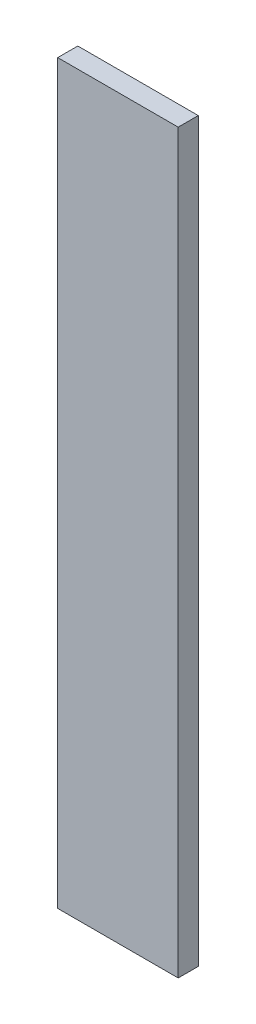
ISO-10303-21;
HEADER;
FILE_DESCRIPTION(('STEP AP214'),'2;1');
FILE_NAME('part.step','',(''),(''),'','','');
FILE_SCHEMA(('AUTOMOTIVE_DESIGN { 1 0 10303 214 1 1 1 1 }'));
ENDSEC;
DATA;
#1=APPLICATION_CONTEXT('core data for automotive mechanical design processes');
#2=APPLICATION_PROTOCOL_DEFINITION('international standard','automotive_design',2000,#1);
#3=PRODUCT_CONTEXT('',#1,'mechanical');
#4=PRODUCT('Part','Part','',(#3));
#5=PRODUCT_RELATED_PRODUCT_CATEGORY('part','',(#4));
#6=PRODUCT_DEFINITION_FORMATION('','',#4);
#7=PRODUCT_DEFINITION_CONTEXT('part definition',#1,'design');
#8=PRODUCT_DEFINITION('design','',#6,#7);
#9=PRODUCT_DEFINITION_SHAPE('','',#8);
#10=(LENGTH_UNIT() NAMED_UNIT(*) SI_UNIT(.MILLI.,.METRE.));
#11=(NAMED_UNIT(*) PLANE_ANGLE_UNIT() SI_UNIT($,.RADIAN.));
#12=(NAMED_UNIT(*) SI_UNIT($,.STERADIAN.) SOLID_ANGLE_UNIT());
#13=UNCERTAINTY_MEASURE_WITH_UNIT(LENGTH_MEASURE(1.E-05),#10,'distance_accuracy_value','');
#14=(GEOMETRIC_REPRESENTATION_CONTEXT(3) GLOBAL_UNCERTAINTY_ASSIGNED_CONTEXT((#13)) GLOBAL_UNIT_ASSIGNED_CONTEXT((#10,
#11,#12)) REPRESENTATION_CONTEXT('',''));
#15=CARTESIAN_POINT('',(0.,0.,0.));
#16=DIRECTION('',(0.,0.,1.));
#17=DIRECTION('',(1.,0.,0.));
#18=AXIS2_PLACEMENT_3D('',#15,#16,#17);
#19=CARTESIAN_POINT('',(15.,-91.75,5.));
#20=DIRECTION('',(-1.,0.,0.));
#21=DIRECTION('',(0.,0.,1.));
#22=AXIS2_PLACEMENT_3D('',#19,#20,#21);
#23=PLANE('',#22);
#24=DIRECTION('',(0.,1.,0.));
#25=VECTOR('',#24,1.);
#26=CARTESIAN_POINT('',(15.,-91.75,0.));
#27=LINE('',#26,#25);
#28=CARTESIAN_POINT('',(15.,-91.75,0.));
#29=VERTEX_POINT('',#28);
#30=CARTESIAN_POINT('',(15.,91.75,0.));
#31=VERTEX_POINT('',#30);
#32=EDGE_CURVE('E96',#29,#31,#27,.T.);
#33=ORIENTED_EDGE('',*,*,#32,.T.);
#34=DIRECTION('',(0.,0.,-1.));
#35=VECTOR('',#34,1.);
#36=CARTESIAN_POINT('',(15.,91.75,5.));
#37=LINE('',#36,#35);
#38=CARTESIAN_POINT('',(15.,91.75,5.));
#39=VERTEX_POINT('',#38);
#40=EDGE_CURVE('E11',#39,#31,#37,.T.);
#41=ORIENTED_EDGE('',*,*,#40,.F.);
#42=DIRECTION('',(0.,1.,0.));
#43=VECTOR('',#42,1.);
#44=CARTESIAN_POINT('',(15.,-91.75,5.));
#45=LINE('',#44,#43);
#46=CARTESIAN_POINT('',(15.,-91.75,5.));
#47=VERTEX_POINT('',#46);
#48=EDGE_CURVE('E84',#47,#39,#45,.T.);
#49=ORIENTED_EDGE('',*,*,#48,.F.);
#50=DIRECTION('',(0.,0.,-1.));
#51=VECTOR('',#50,1.);
#52=CARTESIAN_POINT('',(15.,-91.75,5.));
#53=LINE('',#52,#51);
#54=EDGE_CURVE('E92',#47,#29,#53,.T.);
#55=ORIENTED_EDGE('',*,*,#54,.T.);
#56=EDGE_LOOP('',(#33,#41,#49,#55));
#57=FACE_BOUND('',#56,.T.);
#58=ADVANCED_FACE('F33',(#57),#23,.F.);
#59=CARTESIAN_POINT('',(-15.,91.75,5.));
#60=DIRECTION('',(0.,-1.,0.));
#61=DIRECTION('',(0.,0.,-1.));
#62=AXIS2_PLACEMENT_3D('',#59,#60,#61);
#63=PLANE('',#62);
#64=DIRECTION('',(-1.,0.,0.));
#65=VECTOR('',#64,1.);
#66=CARTESIAN_POINT('',(-15.,91.75,0.));
#67=LINE('',#66,#65);
#68=CARTESIAN_POINT('',(-15.,91.75,0.));
#69=VERTEX_POINT('',#68);
#70=EDGE_CURVE('E88',#31,#69,#67,.T.);
#71=ORIENTED_EDGE('',*,*,#70,.T.);
#72=DIRECTION('',(0.,0.,-1.));
#73=VECTOR('',#72,1.);
#74=CARTESIAN_POINT('',(-15.,91.75,5.));
#75=LINE('',#74,#73);
#76=CARTESIAN_POINT('',(-15.,91.75,5.));
#77=VERTEX_POINT('',#76);
#78=EDGE_CURVE('E41',#77,#69,#75,.T.);
#79=ORIENTED_EDGE('',*,*,#78,.F.);
#80=DIRECTION('',(-1.,0.,0.));
#81=VECTOR('',#80,1.);
#82=CARTESIAN_POINT('',(-15.,91.75,5.));
#83=LINE('',#82,#81);
#84=EDGE_CURVE('E79',#39,#77,#83,.T.);
#85=ORIENTED_EDGE('',*,*,#84,.F.);
#86=ORIENTED_EDGE('',*,*,#40,.T.);
#87=EDGE_LOOP('',(#71,#79,#85,#86));
#88=FACE_BOUND('',#87,.T.);
#89=ADVANCED_FACE('F87',(#88),#63,.F.);
#90=CARTESIAN_POINT('',(-15.,-91.75,5.));
#91=DIRECTION('',(1.,0.,0.));
#92=DIRECTION('',(0.,0.,-1.));
#93=AXIS2_PLACEMENT_3D('',#90,#91,#92);
#94=PLANE('',#93);
#95=DIRECTION('',(0.,-1.,0.));
#96=VECTOR('',#95,1.);
#97=CARTESIAN_POINT('',(-15.,-91.75,0.));
#98=LINE('',#97,#96);
#99=CARTESIAN_POINT('',(-15.,-91.75,0.));
#100=VERTEX_POINT('',#99);
#101=EDGE_CURVE('E66',#69,#100,#98,.T.);
#102=ORIENTED_EDGE('',*,*,#101,.T.);
#103=DIRECTION('',(0.,0.,-1.));
#104=VECTOR('',#103,1.);
#105=CARTESIAN_POINT('',(-15.,-91.75,5.));
#106=LINE('',#105,#104);
#107=CARTESIAN_POINT('',(-15.,-91.75,5.));
#108=VERTEX_POINT('',#107);
#109=EDGE_CURVE('E89',#108,#100,#106,.T.);
#110=ORIENTED_EDGE('',*,*,#109,.F.);
#111=DIRECTION('',(0.,-1.,0.));
#112=VECTOR('',#111,1.);
#113=CARTESIAN_POINT('',(-15.,-91.75,5.));
#114=LINE('',#113,#112);
#115=EDGE_CURVE('E82',#77,#108,#114,.T.);
#116=ORIENTED_EDGE('',*,*,#115,.F.);
#117=ORIENTED_EDGE('',*,*,#78,.T.);
#118=EDGE_LOOP('',(#102,#110,#116,#117));
#119=FACE_BOUND('',#118,.T.);
#120=ADVANCED_FACE('F90',(#119),#94,.F.);
#121=CARTESIAN_POINT('',(-15.,-91.75,5.));
#122=DIRECTION('',(0.,1.,0.));
#123=DIRECTION('',(0.,0.,1.));
#124=AXIS2_PLACEMENT_3D('',#121,#122,#123);
#125=PLANE('',#124);
#126=DIRECTION('',(1.,0.,0.));
#127=VECTOR('',#126,1.);
#128=CARTESIAN_POINT('',(-15.,-91.75,0.));
#129=LINE('',#128,#127);
#130=EDGE_CURVE('E72',#100,#29,#129,.T.);
#131=ORIENTED_EDGE('',*,*,#130,.T.);
#132=ORIENTED_EDGE('',*,*,#54,.F.);
#133=DIRECTION('',(1.,0.,0.));
#134=VECTOR('',#133,1.);
#135=CARTESIAN_POINT('',(-15.,-91.75,5.));
#136=LINE('',#135,#134);
#137=EDGE_CURVE('E49',#108,#47,#136,.T.);
#138=ORIENTED_EDGE('',*,*,#137,.F.);
#139=ORIENTED_EDGE('',*,*,#109,.T.);
#140=EDGE_LOOP('',(#131,#132,#138,#139));
#141=FACE_BOUND('',#140,.T.);
#142=ADVANCED_FACE('F103',(#141),#125,.F.);
#143=CARTESIAN_POINT('',(0.,0.,5.));
#144=DIRECTION('',(0.,0.,-1.));
#145=DIRECTION('',(-1.,0.,0.));
#146=AXIS2_PLACEMENT_3D('',#143,#144,#145);
#147=PLANE('',#146);
#148=ORIENTED_EDGE('',*,*,#48,.T.);
#149=ORIENTED_EDGE('',*,*,#84,.T.);
#150=ORIENTED_EDGE('',*,*,#115,.T.);
#151=ORIENTED_EDGE('',*,*,#137,.T.);
#152=EDGE_LOOP('',(#148,#149,#150,#151));
#153=FACE_BOUND('',#152,.T.);
#154=ADVANCED_FACE('F80',(#153),#147,.F.);
#155=CARTESIAN_POINT('',(0.,0.,0.));
#156=DIRECTION('',(0.,0.,-1.));
#157=DIRECTION('',(-1.,0.,0.));
#158=AXIS2_PLACEMENT_3D('',#155,#156,#157);
#159=PLANE('',#158);
#160=ORIENTED_EDGE('',*,*,#32,.F.);
#161=ORIENTED_EDGE('',*,*,#130,.F.);
#162=ORIENTED_EDGE('',*,*,#101,.F.);
#163=ORIENTED_EDGE('',*,*,#70,.F.);
#164=EDGE_LOOP('',(#160,#161,#162,#163));
#165=FACE_BOUND('',#164,.T.);
#166=ADVANCED_FACE('F106',(#165),#159,.T.);
#167=CLOSED_SHELL('',(#58,#89,#120,#142,#154,#166));
#168=MANIFOLD_SOLID_BREP('B2',#167);
#169=ADVANCED_BREP_SHAPE_REPRESENTATION('',(#18,#168),#14);
#170=SHAPE_DEFINITION_REPRESENTATION(#9,#169);
ENDSEC;
END-ISO-10303-21;
